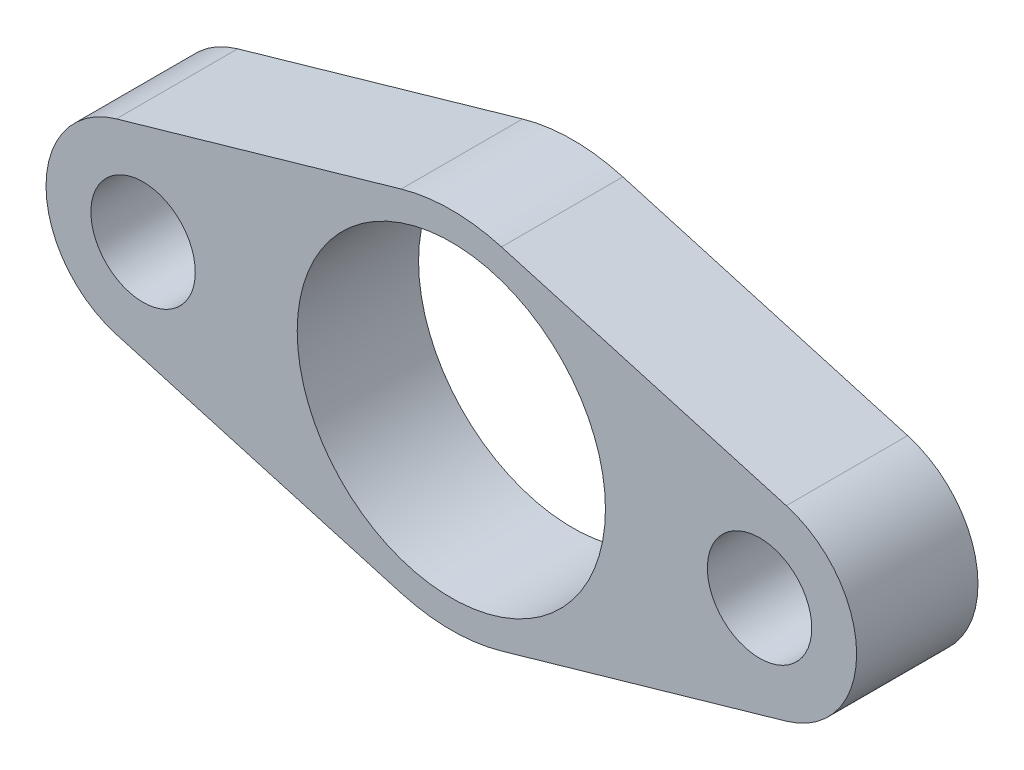
ISO-10303-21;
HEADER;
FILE_DESCRIPTION(('STEP AP214'),'2;1');
FILE_NAME('part.step','',(''),(''),'','','');
FILE_SCHEMA(('AUTOMOTIVE_DESIGN { 1 0 10303 214 1 1 1 1 }'));
ENDSEC;
DATA;
#1=APPLICATION_CONTEXT('core data for automotive mechanical design processes');
#2=APPLICATION_PROTOCOL_DEFINITION('international standard','automotive_design',2000,#1);
#3=PRODUCT_CONTEXT('',#1,'mechanical');
#4=PRODUCT('Part','Part','',(#3));
#5=PRODUCT_RELATED_PRODUCT_CATEGORY('part','',(#4));
#6=PRODUCT_DEFINITION_FORMATION('','',#4);
#7=PRODUCT_DEFINITION_CONTEXT('part definition',#1,'design');
#8=PRODUCT_DEFINITION('design','',#6,#7);
#9=PRODUCT_DEFINITION_SHAPE('','',#8);
#10=(LENGTH_UNIT() NAMED_UNIT(*) SI_UNIT(.MILLI.,.METRE.));
#11=(NAMED_UNIT(*) PLANE_ANGLE_UNIT() SI_UNIT($,.RADIAN.));
#12=(NAMED_UNIT(*) SI_UNIT($,.STERADIAN.) SOLID_ANGLE_UNIT());
#13=UNCERTAINTY_MEASURE_WITH_UNIT(LENGTH_MEASURE(1.E-05),#10,'distance_accuracy_value','');
#14=(GEOMETRIC_REPRESENTATION_CONTEXT(3) GLOBAL_UNCERTAINTY_ASSIGNED_CONTEXT((#13)) GLOBAL_UNIT_ASSIGNED_CONTEXT((#10,
#11,#12)) REPRESENTATION_CONTEXT('',''));
#15=CARTESIAN_POINT('',(0.,0.,0.));
#16=DIRECTION('',(0.,0.,1.));
#17=DIRECTION('',(1.,0.,0.));
#18=AXIS2_PLACEMENT_3D('',#15,#16,#17);
#19=CARTESIAN_POINT('',(2.06692913385827,7.20956336788907,5.));
#20=DIRECTION('',(0.275590551181103,0.961275115718542,0.));
#21=DIRECTION('',(-0.961275115718542,0.275590551181103,0.));
#22=AXIS2_PLACEMENT_3D('',#19,#20,#21);
#23=PLANE('',#22);
#24=DIRECTION('',(0.961275115718542,-0.275590551181103,0.));
#25=VECTOR('',#24,1.);
#26=CARTESIAN_POINT('',(2.06692913385827,7.20956336788907,0.));
#27=LINE('',#26,#25);
#28=CARTESIAN_POINT('',(2.06692913385827,7.20956336788907,0.));
#29=VERTEX_POINT('',#28);
#30=CARTESIAN_POINT('',(13.8023622047244,3.84510046287417,0.));
#31=VERTEX_POINT('',#30);
#32=EDGE_CURVE('E150',#29,#31,#27,.T.);
#33=ORIENTED_EDGE('',*,*,#32,.F.);
#34=DIRECTION('',(0.,0.,-1.));
#35=VECTOR('',#34,1.);
#36=CARTESIAN_POINT('',(2.06692913385827,7.20956336788907,5.));
#37=LINE('',#36,#35);
#38=CARTESIAN_POINT('',(2.06692913385827,7.20956336788907,5.));
#39=VERTEX_POINT('',#38);
#40=EDGE_CURVE('E11',#39,#29,#37,.T.);
#41=ORIENTED_EDGE('',*,*,#40,.F.);
#42=DIRECTION('',(0.961275115718542,-0.275590551181103,0.));
#43=VECTOR('',#42,1.);
#44=CARTESIAN_POINT('',(2.06692913385827,7.20956336788907,5.));
#45=LINE('',#44,#43);
#46=CARTESIAN_POINT('',(13.8023622047244,3.84510046287417,5.));
#47=VERTEX_POINT('',#46);
#48=EDGE_CURVE('E216',#39,#47,#45,.T.);
#49=ORIENTED_EDGE('',*,*,#48,.T.);
#50=DIRECTION('',(0.,0.,-1.));
#51=VECTOR('',#50,1.);
#52=CARTESIAN_POINT('',(13.8023622047244,3.84510046287417,5.));
#53=LINE('',#52,#51);
#54=EDGE_CURVE('E91',#47,#31,#53,.T.);
#55=ORIENTED_EDGE('',*,*,#54,.T.);
#56=EDGE_LOOP('',(#33,#41,#49,#55));
#57=FACE_BOUND('',#56,.T.);
#58=ADVANCED_FACE('F39',(#57),#23,.T.);
#59=CARTESIAN_POINT('',(0.,0.,5.));
#60=DIRECTION('',(0.,0.,-1.));
#61=DIRECTION('',(-1.,0.,0.));
#62=AXIS2_PLACEMENT_3D('',#59,#60,#61);
#63=CYLINDRICAL_SURFACE('',#62,7.5);
#64=CARTESIAN_POINT('',(0.,0.,0.));
#65=DIRECTION('',(0.,0.,1.));
#66=DIRECTION('',(1.,0.,0.));
#67=AXIS2_PLACEMENT_3D('',#64,#65,#66);
#68=CIRCLE('',#67,7.5);
#69=CARTESIAN_POINT('',(-2.06692913385827,7.20956336788906,0.));
#70=VERTEX_POINT('',#69);
#71=EDGE_CURVE('E154',#29,#70,#68,.T.);
#72=ORIENTED_EDGE('',*,*,#71,.T.);
#73=DIRECTION('',(0.,0.,-1.));
#74=VECTOR('',#73,1.);
#75=CARTESIAN_POINT('',(-2.06692913385827,7.20956336788906,5.));
#76=LINE('',#75,#74);
#77=CARTESIAN_POINT('',(-2.06692913385827,7.20956336788906,5.));
#78=VERTEX_POINT('',#77);
#79=EDGE_CURVE('E49',#78,#70,#76,.T.);
#80=ORIENTED_EDGE('',*,*,#79,.F.);
#81=CARTESIAN_POINT('',(0.,0.,5.));
#82=DIRECTION('',(0.,0.,1.));
#83=DIRECTION('',(1.,0.,0.));
#84=AXIS2_PLACEMENT_3D('',#81,#82,#83);
#85=CIRCLE('',#84,7.5);
#86=EDGE_CURVE('E212',#39,#78,#85,.T.);
#87=ORIENTED_EDGE('',*,*,#86,.F.);
#88=ORIENTED_EDGE('',*,*,#40,.T.);
#89=EDGE_LOOP('',(#72,#80,#87,#88));
#90=FACE_BOUND('',#89,.T.);
#91=ADVANCED_FACE('F201',(#90),#63,.T.);
#92=CARTESIAN_POINT('',(-2.06692913385827,7.20956336788906,5.));
#93=DIRECTION('',(-0.275590551181102,0.961275115718542,0.));
#94=DIRECTION('',(-0.961275115718542,-0.275590551181102,0.));
#95=AXIS2_PLACEMENT_3D('',#92,#93,#94);
#96=PLANE('',#95);
#97=DIRECTION('',(0.961275115718542,0.275590551181102,0.));
#98=VECTOR('',#97,1.);
#99=CARTESIAN_POINT('',(-2.06692913385827,7.20956336788906,0.));
#100=LINE('',#99,#98);
#101=CARTESIAN_POINT('',(-13.8023622047244,3.84510046287417,0.));
#102=VERTEX_POINT('',#101);
#103=EDGE_CURVE('E158',#102,#70,#100,.T.);
#104=ORIENTED_EDGE('',*,*,#103,.F.);
#105=DIRECTION('',(0.,0.,-1.));
#106=VECTOR('',#105,1.);
#107=CARTESIAN_POINT('',(-13.8023622047244,3.84510046287417,5.));
#108=LINE('',#107,#106);
#109=CARTESIAN_POINT('',(-13.8023622047244,3.84510046287417,5.));
#110=VERTEX_POINT('',#109);
#111=EDGE_CURVE('E189',#110,#102,#108,.T.);
#112=ORIENTED_EDGE('',*,*,#111,.F.);
#113=DIRECTION('',(0.961275115718542,0.275590551181102,0.));
#114=VECTOR('',#113,1.);
#115=CARTESIAN_POINT('',(-2.06692913385827,7.20956336788906,5.));
#116=LINE('',#115,#114);
#117=EDGE_CURVE('E198',#110,#78,#116,.T.);
#118=ORIENTED_EDGE('',*,*,#117,.T.);
#119=ORIENTED_EDGE('',*,*,#79,.T.);
#120=EDGE_LOOP('',(#104,#112,#118,#119));
#121=FACE_BOUND('',#120,.T.);
#122=ADVANCED_FACE('F196',(#121),#96,.T.);
#123=CARTESIAN_POINT('',(-12.7,0.,5.));
#124=DIRECTION('',(0.,0.,-1.));
#125=DIRECTION('',(-1.,0.,0.));
#126=AXIS2_PLACEMENT_3D('',#123,#124,#125);
#127=CYLINDRICAL_SURFACE('',#126,4.);
#128=CARTESIAN_POINT('',(-12.7,0.,0.));
#129=DIRECTION('',(0.,0.,1.));
#130=DIRECTION('',(1.,0.,0.));
#131=AXIS2_PLACEMENT_3D('',#128,#129,#130);
#132=CIRCLE('',#131,4.);
#133=CARTESIAN_POINT('',(-13.8023622047244,-3.84510046287417,0.));
#134=VERTEX_POINT('',#133);
#135=EDGE_CURVE('E162',#102,#134,#132,.T.);
#136=ORIENTED_EDGE('',*,*,#135,.T.);
#137=DIRECTION('',(0.,0.,-1.));
#138=VECTOR('',#137,1.);
#139=CARTESIAN_POINT('',(-13.8023622047244,-3.84510046287417,5.));
#140=LINE('',#139,#138);
#141=CARTESIAN_POINT('',(-13.8023622047244,-3.84510046287417,5.));
#142=VERTEX_POINT('',#141);
#143=EDGE_CURVE('E185',#142,#134,#140,.T.);
#144=ORIENTED_EDGE('',*,*,#143,.F.);
#145=CARTESIAN_POINT('',(-12.7,0.,5.));
#146=DIRECTION('',(0.,0.,1.));
#147=DIRECTION('',(1.,0.,0.));
#148=AXIS2_PLACEMENT_3D('',#145,#146,#147);
#149=CIRCLE('',#148,4.);
#150=EDGE_CURVE('E209',#110,#142,#149,.T.);
#151=ORIENTED_EDGE('',*,*,#150,.F.);
#152=ORIENTED_EDGE('',*,*,#111,.T.);
#153=EDGE_LOOP('',(#136,#144,#151,#152));
#154=FACE_BOUND('',#153,.T.);
#155=ADVANCED_FACE('F207',(#154),#127,.T.);
#156=CARTESIAN_POINT('',(-2.06692913385827,-7.20956336788906,5.));
#157=DIRECTION('',(0.275590551181102,0.961275115718542,0.));
#158=DIRECTION('',(-0.961275115718542,0.275590551181102,0.));
#159=AXIS2_PLACEMENT_3D('',#156,#157,#158);
#160=PLANE('',#159);
#161=DIRECTION('',(0.961275115718542,-0.275590551181102,0.));
#162=VECTOR('',#161,1.);
#163=CARTESIAN_POINT('',(-2.06692913385827,-7.20956336788906,0.));
#164=LINE('',#163,#162);
#165=CARTESIAN_POINT('',(-2.06692913385827,-7.20956336788906,0.));
#166=VERTEX_POINT('',#165);
#167=EDGE_CURVE('E166',#134,#166,#164,.T.);
#168=ORIENTED_EDGE('',*,*,#167,.T.);
#169=DIRECTION('',(0.,0.,-1.));
#170=VECTOR('',#169,1.);
#171=CARTESIAN_POINT('',(-2.06692913385827,-7.20956336788906,5.));
#172=LINE('',#171,#170);
#173=CARTESIAN_POINT('',(-2.06692913385827,-7.20956336788906,5.));
#174=VERTEX_POINT('',#173);
#175=EDGE_CURVE('E129',#174,#166,#172,.T.);
#176=ORIENTED_EDGE('',*,*,#175,.F.);
#177=DIRECTION('',(0.961275115718542,-0.275590551181102,0.));
#178=VECTOR('',#177,1.);
#179=CARTESIAN_POINT('',(-2.06692913385827,-7.20956336788906,5.));
#180=LINE('',#179,#178);
#181=EDGE_CURVE('E115',#142,#174,#180,.T.);
#182=ORIENTED_EDGE('',*,*,#181,.F.);
#183=ORIENTED_EDGE('',*,*,#143,.T.);
#184=EDGE_LOOP('',(#168,#176,#182,#183));
#185=FACE_BOUND('',#184,.T.);
#186=ADVANCED_FACE('F282',(#185),#160,.F.);
#187=CARTESIAN_POINT('',(0.,0.,5.));
#188=DIRECTION('',(0.,0.,-1.));
#189=DIRECTION('',(-1.,0.,0.));
#190=AXIS2_PLACEMENT_3D('',#187,#188,#189);
#191=CYLINDRICAL_SURFACE('',#190,7.5);
#192=CARTESIAN_POINT('',(0.,0.,0.));
#193=DIRECTION('',(0.,0.,1.));
#194=DIRECTION('',(1.,0.,0.));
#195=AXIS2_PLACEMENT_3D('',#192,#193,#194);
#196=CIRCLE('',#195,7.5);
#197=CARTESIAN_POINT('',(2.06692913385827,-7.20956336788907,0.));
#198=VERTEX_POINT('',#197);
#199=EDGE_CURVE('E124',#166,#198,#196,.T.);
#200=ORIENTED_EDGE('',*,*,#199,.T.);
#201=DIRECTION('',(0.,0.,-1.));
#202=VECTOR('',#201,1.);
#203=CARTESIAN_POINT('',(2.06692913385827,-7.20956336788907,5.));
#204=LINE('',#203,#202);
#205=CARTESIAN_POINT('',(2.06692913385827,-7.20956336788907,5.));
#206=VERTEX_POINT('',#205);
#207=EDGE_CURVE('E122',#206,#198,#204,.T.);
#208=ORIENTED_EDGE('',*,*,#207,.F.);
#209=CARTESIAN_POINT('',(0.,0.,5.));
#210=DIRECTION('',(0.,0.,1.));
#211=DIRECTION('',(1.,0.,0.));
#212=AXIS2_PLACEMENT_3D('',#209,#210,#211);
#213=CIRCLE('',#212,7.5);
#214=EDGE_CURVE('E109',#174,#206,#213,.T.);
#215=ORIENTED_EDGE('',*,*,#214,.F.);
#216=ORIENTED_EDGE('',*,*,#175,.T.);
#217=EDGE_LOOP('',(#200,#208,#215,#216));
#218=FACE_BOUND('',#217,.T.);
#219=ADVANCED_FACE('F123',(#218),#191,.T.);
#220=CARTESIAN_POINT('',(2.06692913385827,-7.20956336788907,5.));
#221=DIRECTION('',(0.275590551181103,-0.961275115718542,0.));
#222=DIRECTION('',(0.961275115718542,0.275590551181103,0.));
#223=AXIS2_PLACEMENT_3D('',#220,#221,#222);
#224=PLANE('',#223);
#225=DIRECTION('',(-0.961275115718542,-0.275590551181103,0.));
#226=VECTOR('',#225,1.);
#227=CARTESIAN_POINT('',(2.06692913385827,-7.20956336788907,0.));
#228=LINE('',#227,#226);
#229=CARTESIAN_POINT('',(13.8023622047244,-3.84510046287417,0.));
#230=VERTEX_POINT('',#229);
#231=EDGE_CURVE('E172',#230,#198,#228,.T.);
#232=ORIENTED_EDGE('',*,*,#231,.F.);
#233=DIRECTION('',(0.,0.,-1.));
#234=VECTOR('',#233,1.);
#235=CARTESIAN_POINT('',(13.8023622047244,-3.84510046287417,5.));
#236=LINE('',#235,#234);
#237=CARTESIAN_POINT('',(13.8023622047244,-3.84510046287417,5.));
#238=VERTEX_POINT('',#237);
#239=EDGE_CURVE('E84',#238,#230,#236,.T.);
#240=ORIENTED_EDGE('',*,*,#239,.F.);
#241=DIRECTION('',(-0.961275115718542,-0.275590551181103,0.));
#242=VECTOR('',#241,1.);
#243=CARTESIAN_POINT('',(2.06692913385827,-7.20956336788907,5.));
#244=LINE('',#243,#242);
#245=EDGE_CURVE('E113',#238,#206,#244,.T.);
#246=ORIENTED_EDGE('',*,*,#245,.T.);
#247=ORIENTED_EDGE('',*,*,#207,.T.);
#248=EDGE_LOOP('',(#232,#240,#246,#247));
#249=FACE_BOUND('',#248,.T.);
#250=ADVANCED_FACE('F131',(#249),#224,.T.);
#251=CARTESIAN_POINT('',(-12.7,0.,5.));
#252=DIRECTION('',(0.,0.,-1.));
#253=DIRECTION('',(-1.,0.,0.));
#254=AXIS2_PLACEMENT_3D('',#251,#252,#253);
#255=CYLINDRICAL_SURFACE('',#254,2.15);
#256=CARTESIAN_POINT('',(-12.7,0.,5.));
#257=DIRECTION('',(0.,0.,1.));
#258=DIRECTION('',(1.,0.,0.));
#259=AXIS2_PLACEMENT_3D('',#256,#257,#258);
#260=CIRCLE('',#259,2.15);
#261=CARTESIAN_POINT('',(-10.55,0.,5.));
#262=VERTEX_POINT('',#261);
#263=EDGE_CURVE('E222',#262,#262,#260,.T.);
#264=ORIENTED_EDGE('',*,*,#263,.T.);
#265=EDGE_LOOP('',(#264));
#266=FACE_BOUND('',#265,.T.);
#267=CARTESIAN_POINT('',(-12.7,0.,0.));
#268=DIRECTION('',(0.,0.,1.));
#269=DIRECTION('',(1.,0.,0.));
#270=AXIS2_PLACEMENT_3D('',#267,#268,#269);
#271=CIRCLE('',#270,2.15);
#272=CARTESIAN_POINT('',(-10.55,0.,0.));
#273=VERTEX_POINT('',#272);
#274=EDGE_CURVE('E146',#273,#273,#271,.T.);
#275=ORIENTED_EDGE('',*,*,#274,.F.);
#276=EDGE_LOOP('',(#275));
#277=FACE_BOUND('',#276,.T.);
#278=ADVANCED_FACE('F244',(#266,#277),#255,.F.);
#279=CARTESIAN_POINT('',(12.7,0.,5.));
#280=DIRECTION('',(0.,0.,-1.));
#281=DIRECTION('',(-1.,0.,0.));
#282=AXIS2_PLACEMENT_3D('',#279,#280,#281);
#283=CYLINDRICAL_SURFACE('',#282,2.15);
#284=CARTESIAN_POINT('',(12.7,0.,5.));
#285=DIRECTION('',(0.,0.,1.));
#286=DIRECTION('',(1.,0.,0.));
#287=AXIS2_PLACEMENT_3D('',#284,#285,#286);
#288=CIRCLE('',#287,2.15);
#289=CARTESIAN_POINT('',(14.85,0.,5.));
#290=VERTEX_POINT('',#289);
#291=EDGE_CURVE('E226',#290,#290,#288,.T.);
#292=ORIENTED_EDGE('',*,*,#291,.T.);
#293=EDGE_LOOP('',(#292));
#294=FACE_BOUND('',#293,.T.);
#295=CARTESIAN_POINT('',(12.7,0.,0.));
#296=DIRECTION('',(0.,0.,1.));
#297=DIRECTION('',(1.,0.,0.));
#298=AXIS2_PLACEMENT_3D('',#295,#296,#297);
#299=CIRCLE('',#298,2.15);
#300=CARTESIAN_POINT('',(14.85,0.,0.));
#301=VERTEX_POINT('',#300);
#302=EDGE_CURVE('E142',#301,#301,#299,.T.);
#303=ORIENTED_EDGE('',*,*,#302,.F.);
#304=EDGE_LOOP('',(#303));
#305=FACE_BOUND('',#304,.T.);
#306=ADVANCED_FACE('F247',(#294,#305),#283,.F.);
#307=CARTESIAN_POINT('',(0.,0.,5.));
#308=DIRECTION('',(0.,0.,-1.));
#309=DIRECTION('',(-1.,0.,0.));
#310=AXIS2_PLACEMENT_3D('',#307,#308,#309);
#311=CYLINDRICAL_SURFACE('',#310,6.35);
#312=CARTESIAN_POINT('',(0.,0.,5.));
#313=DIRECTION('',(0.,0.,1.));
#314=DIRECTION('',(1.,0.,0.));
#315=AXIS2_PLACEMENT_3D('',#312,#313,#314);
#316=CIRCLE('',#315,6.35);
#317=CARTESIAN_POINT('',(6.35,0.,5.));
#318=VERTEX_POINT('',#317);
#319=EDGE_CURVE('E178',#318,#318,#316,.T.);
#320=ORIENTED_EDGE('',*,*,#319,.T.);
#321=EDGE_LOOP('',(#320));
#322=FACE_BOUND('',#321,.T.);
#323=CARTESIAN_POINT('',(0.,0.,0.));
#324=DIRECTION('',(0.,0.,1.));
#325=DIRECTION('',(1.,0.,0.));
#326=AXIS2_PLACEMENT_3D('',#323,#324,#325);
#327=CIRCLE('',#326,6.35);
#328=CARTESIAN_POINT('',(6.35,0.,0.));
#329=VERTEX_POINT('',#328);
#330=EDGE_CURVE('E138',#329,#329,#327,.T.);
#331=ORIENTED_EDGE('',*,*,#330,.F.);
#332=EDGE_LOOP('',(#331));
#333=FACE_BOUND('',#332,.T.);
#334=ADVANCED_FACE('F41',(#322,#333),#311,.F.);
#335=CARTESIAN_POINT('',(12.7,0.,5.));
#336=DIRECTION('',(0.,0.,-1.));
#337=DIRECTION('',(-1.,0.,0.));
#338=AXIS2_PLACEMENT_3D('',#335,#336,#337);
#339=CYLINDRICAL_SURFACE('',#338,4.);
#340=CARTESIAN_POINT('',(12.7,0.,0.));
#341=DIRECTION('',(0.,0.,1.));
#342=DIRECTION('',(1.,0.,0.));
#343=AXIS2_PLACEMENT_3D('',#340,#341,#342);
#344=CIRCLE('',#343,4.);
#345=EDGE_CURVE('E175',#230,#31,#344,.T.);
#346=ORIENTED_EDGE('',*,*,#345,.T.);
#347=ORIENTED_EDGE('',*,*,#54,.F.);
#348=CARTESIAN_POINT('',(12.7,0.,5.));
#349=DIRECTION('',(0.,0.,1.));
#350=DIRECTION('',(1.,0.,0.));
#351=AXIS2_PLACEMENT_3D('',#348,#349,#350);
#352=CIRCLE('',#351,4.);
#353=EDGE_CURVE('E57',#238,#47,#352,.T.);
#354=ORIENTED_EDGE('',*,*,#353,.F.);
#355=ORIENTED_EDGE('',*,*,#239,.T.);
#356=EDGE_LOOP('',(#346,#347,#354,#355));
#357=FACE_BOUND('',#356,.T.);
#358=ADVANCED_FACE('F238',(#357),#339,.T.);
#359=CARTESIAN_POINT('',(0.,0.,5.));
#360=DIRECTION('',(0.,0.,1.));
#361=DIRECTION('',(1.,0.,0.));
#362=AXIS2_PLACEMENT_3D('',#359,#360,#361);
#363=PLANE('',#362);
#364=ORIENTED_EDGE('',*,*,#319,.F.);
#365=EDGE_LOOP('',(#364));
#366=FACE_BOUND('',#365,.T.);
#367=ORIENTED_EDGE('',*,*,#291,.F.);
#368=EDGE_LOOP('',(#367));
#369=FACE_BOUND('',#368,.T.);
#370=ORIENTED_EDGE('',*,*,#263,.F.);
#371=EDGE_LOOP('',(#370));
#372=FACE_BOUND('',#371,.T.);
#373=ORIENTED_EDGE('',*,*,#48,.F.);
#374=ORIENTED_EDGE('',*,*,#86,.T.);
#375=ORIENTED_EDGE('',*,*,#117,.F.);
#376=ORIENTED_EDGE('',*,*,#150,.T.);
#377=ORIENTED_EDGE('',*,*,#181,.T.);
#378=ORIENTED_EDGE('',*,*,#214,.T.);
#379=ORIENTED_EDGE('',*,*,#245,.F.);
#380=ORIENTED_EDGE('',*,*,#353,.T.);
#381=EDGE_LOOP('',(#373,#374,#375,#376,#377,#378,#379,#380));
#382=FACE_BOUND('',#381,.T.);
#383=ADVANCED_FACE('F111',(#366,#369,#372,#382),#363,.T.);
#384=CARTESIAN_POINT('',(0.,0.,0.));
#385=DIRECTION('',(0.,0.,1.));
#386=DIRECTION('',(1.,0.,0.));
#387=AXIS2_PLACEMENT_3D('',#384,#385,#386);
#388=PLANE('',#387);
#389=ORIENTED_EDGE('',*,*,#330,.T.);
#390=EDGE_LOOP('',(#389));
#391=FACE_BOUND('',#390,.T.);
#392=ORIENTED_EDGE('',*,*,#302,.T.);
#393=EDGE_LOOP('',(#392));
#394=FACE_BOUND('',#393,.T.);
#395=ORIENTED_EDGE('',*,*,#274,.T.);
#396=EDGE_LOOP('',(#395));
#397=FACE_BOUND('',#396,.T.);
#398=ORIENTED_EDGE('',*,*,#32,.T.);
#399=ORIENTED_EDGE('',*,*,#345,.F.);
#400=ORIENTED_EDGE('',*,*,#231,.T.);
#401=ORIENTED_EDGE('',*,*,#199,.F.);
#402=ORIENTED_EDGE('',*,*,#167,.F.);
#403=ORIENTED_EDGE('',*,*,#135,.F.);
#404=ORIENTED_EDGE('',*,*,#103,.T.);
#405=ORIENTED_EDGE('',*,*,#71,.F.);
#406=EDGE_LOOP('',(#398,#399,#400,#401,#402,#403,#404,#405));
#407=FACE_BOUND('',#406,.T.);
#408=ADVANCED_FACE('F204',(#391,#394,#397,#407),#388,.F.);
#409=CLOSED_SHELL('',(#58,#91,#122,#155,#186,#219,#250,#278,#306,#334,#358,#383,#408));
#410=MANIFOLD_SOLID_BREP('B2',#409);
#411=ADVANCED_BREP_SHAPE_REPRESENTATION('',(#18,#410),#14);
#412=SHAPE_DEFINITION_REPRESENTATION(#9,#411);
ENDSEC;
END-ISO-10303-21;
